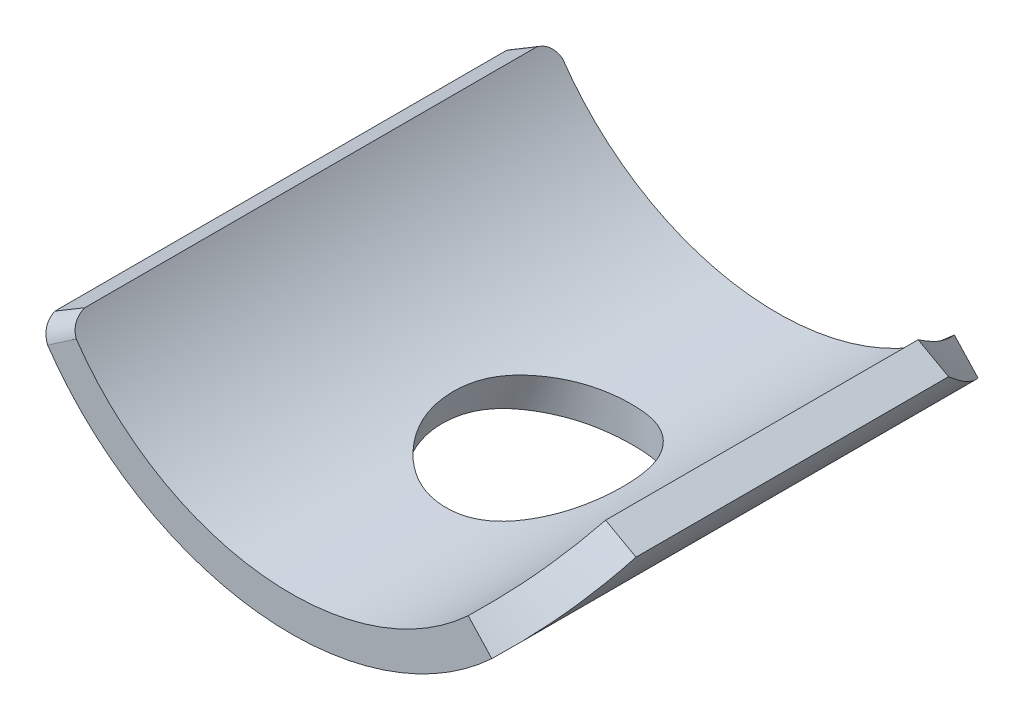
ISO-10303-21;
HEADER;
FILE_DESCRIPTION(('STEP AP214'),'2;1');
FILE_NAME('part.step','',(''),(''),'','','');
FILE_SCHEMA(('AUTOMOTIVE_DESIGN { 1 0 10303 214 1 1 1 1 }'));
ENDSEC;
DATA;
#1=APPLICATION_CONTEXT('core data for automotive mechanical design processes');
#2=APPLICATION_PROTOCOL_DEFINITION('international standard','automotive_design',2000,#1);
#3=PRODUCT_CONTEXT('',#1,'mechanical');
#4=PRODUCT('Part','Part','',(#3));
#5=PRODUCT_RELATED_PRODUCT_CATEGORY('part','',(#4));
#6=PRODUCT_DEFINITION_FORMATION('','',#4);
#7=PRODUCT_DEFINITION_CONTEXT('part definition',#1,'design');
#8=PRODUCT_DEFINITION('design','',#6,#7);
#9=PRODUCT_DEFINITION_SHAPE('','',#8);
#10=(LENGTH_UNIT() NAMED_UNIT(*) SI_UNIT(.MILLI.,.METRE.));
#11=(NAMED_UNIT(*) PLANE_ANGLE_UNIT() SI_UNIT($,.RADIAN.));
#12=(NAMED_UNIT(*) SI_UNIT($,.STERADIAN.) SOLID_ANGLE_UNIT());
#13=UNCERTAINTY_MEASURE_WITH_UNIT(LENGTH_MEASURE(1.E-05),#10,'distance_accuracy_value','');
#14=(GEOMETRIC_REPRESENTATION_CONTEXT(3) GLOBAL_UNCERTAINTY_ASSIGNED_CONTEXT((#13)) GLOBAL_UNIT_ASSIGNED_CONTEXT((#10,
#11,#12)) REPRESENTATION_CONTEXT('',''));
#15=CARTESIAN_POINT('',(0.,0.,0.));
#16=DIRECTION('',(0.,0.,1.));
#17=DIRECTION('',(1.,0.,0.));
#18=AXIS2_PLACEMENT_3D('',#15,#16,#17);
#19=CARTESIAN_POINT('',(-0.0587403609566177,3.73980298090454,-14.));
#20=DIRECTION('',(0.,0.,1.));
#21=DIRECTION('',(1.,0.,0.));
#22=AXIS2_PLACEMENT_3D('',#19,#20,#21);
#23=PLANE('',#22);
#24=CARTESIAN_POINT('',(5.72240006796672,-2.49144210664161,-14.));
#25=CARTESIAN_POINT('',(5.04226589985809,-1.75835444928324,-14.));
#26=B_SPLINE_CURVE_WITH_KNOTS('',1,(#24,#25),.UNSPECIFIED.,.F.,.F.,(2,2),(0.,1.),.UNSPECIFIED.);
#27=CARTESIAN_POINT('',(5.72240006796673,-2.49144210664161,-14.));
#28=VERTEX_POINT('',#27);
#29=CARTESIAN_POINT('',(5.0422658998581,-1.75835444928324,-14.));
#30=VERTEX_POINT('',#29);
#31=EDGE_CURVE('E12',#28,#30,#26,.T.);
#32=ORIENTED_EDGE('',*,*,#31,.F.);
#33=CARTESIAN_POINT('',(-0.0587403609566177,3.73980298090454,-14.));
#34=DIRECTION('',(0.,0.,-1.));
#35=DIRECTION('',(-1.,0.,0.));
#36=AXIS2_PLACEMENT_3D('',#33,#34,#35);
#37=CIRCLE('',#36,8.5);
#38=CARTESIAN_POINT('',(-7.06882307745616,-1.06735213494459,-14.));
#39=VERTEX_POINT('',#38);
#40=EDGE_CURVE('E143',#28,#39,#37,.T.);
#41=ORIENTED_EDGE('',*,*,#40,.T.);
#42=CARTESIAN_POINT('',(-6.24410746375033,-0.501804474256459,-14.));
#43=CARTESIAN_POINT('',(-7.06882307745615,-1.06735213494459,-14.));
#44=B_SPLINE_CURVE_WITH_KNOTS('',1,(#42,#43),.UNSPECIFIED.,.F.,.F.,(2,2),(0.,1.),.UNSPECIFIED.);
#45=CARTESIAN_POINT('',(-6.24410746375033,-0.501804474256458,-14.));
#46=VERTEX_POINT('',#45);
#47=EDGE_CURVE('E102',#39,#46,#44,.F.);
#48=ORIENTED_EDGE('',*,*,#47,.T.);
#49=CARTESIAN_POINT('',(-0.0587403609566177,3.73980298090454,-14.));
#50=DIRECTION('',(0.,0.,-1.));
#51=DIRECTION('',(-1.,0.,0.));
#52=AXIS2_PLACEMENT_3D('',#49,#50,#51);
#53=CIRCLE('',#52,7.5);
#54=EDGE_CURVE('E146',#30,#46,#53,.T.);
#55=ORIENTED_EDGE('',*,*,#54,.F.);
#56=EDGE_LOOP('',(#32,#41,#48,#55));
#57=FACE_BOUND('',#56,.T.);
#58=ADVANCED_FACE('F88',(#57),#23,.F.);
#59=CARTESIAN_POINT('',(-7.06882307745615,-1.06735213494459,-14.));
#60=CARTESIAN_POINT('',(-7.1560028578225,-0.940221335782435,-13.9592446659592));
#61=CARTESIAN_POINT('',(-7.22161561753153,-0.837451372219732,-13.8972039764516));
#62=CARTESIAN_POINT('',(-7.3165775530413,-0.685334152297158,-13.7305373097849));
#63=CARTESIAN_POINT('',(-7.34593460830596,-0.635975141826172,-13.6259131758616));
#64=CARTESIAN_POINT('',(-7.35883461853912,-0.61434720373666,-13.5));
#65=CARTESIAN_POINT('',(-6.24410746375033,-0.501804474256459,-14.));
#66=CARTESIAN_POINT('',(-6.32103071570813,-0.389630361699026,-13.9592447102836));
#67=CARTESIAN_POINT('',(-6.37892441087566,-0.298950860087465,-13.8972039764516));
#68=CARTESIAN_POINT('',(-6.46271435397251,-0.164729783685193,-13.7305373097849));
#69=CARTESIAN_POINT('',(-6.48861762664849,-0.121177734703874,-13.6259133017605));
#70=CARTESIAN_POINT('',(-6.5,-0.102094240837695,-13.5));
#71=B_SPLINE_SURFACE_WITH_KNOTS('',1,3,((#59,#60,#61,#62,#63,#64),(#65,#66,#67,#68,#69,#70)),
.UNSPECIFIED.,.F.,.F.,.F.,(2,2),(4,2,4),(0.,1.),(0.,0.5,1.),.UNSPECIFIED.);
#72=CARTESIAN_POINT('',(-7.06882307745615,-1.06735213494459,-14.));
#73=CARTESIAN_POINT('',(-7.1560028578225,-0.940221335782435,-13.9592446659592));
#74=CARTESIAN_POINT('',(-7.22161561753153,-0.837451372219732,-13.8972039764516));
#75=CARTESIAN_POINT('',(-7.3165775530413,-0.685334152297158,-13.7305373097849));
#76=CARTESIAN_POINT('',(-7.34593460830596,-0.635975141826172,-13.6259131758616));
#77=CARTESIAN_POINT('',(-7.35883461853912,-0.61434720373666,-13.5));
#78=B_SPLINE_CURVE_WITH_KNOTS('',3,(#72,#73,#74,#75,#76,#77),.UNSPECIFIED.,.F.,.F.,(4,2,4),(0.,
0.5,1.),.UNSPECIFIED.);
#79=CARTESIAN_POINT('',(-7.35883461853912,-0.61434720373666,-13.5));
#80=VERTEX_POINT('',#79);
#81=EDGE_CURVE('E164',#39,#80,#78,.T.);
#82=CARTESIAN_POINT('',(-7.35883461853912,-0.61434720373666,-13.5));
#83=CARTESIAN_POINT('',(-6.5,-0.102094240837695,-13.5));
#84=B_SPLINE_CURVE_WITH_KNOTS('',1,(#82,#83),.UNSPECIFIED.,.F.,.F.,(2,2),(0.,1.),.UNSPECIFIED.);
#85=CARTESIAN_POINT('',(-6.5,-0.102094240837695,-13.5));
#86=VERTEX_POINT('',#85);
#87=EDGE_CURVE('E263',#80,#86,#84,.T.);
#88=CARTESIAN_POINT('',(-6.5,-0.102094240837695,-13.5));
#89=CARTESIAN_POINT('',(-6.48861762664849,-0.121177734703874,-13.6259133017605));
#90=CARTESIAN_POINT('',(-6.46271435397251,-0.164729783685193,-13.7305373097849));
#91=CARTESIAN_POINT('',(-6.37892441087566,-0.298950860087465,-13.8972039764516));
#92=CARTESIAN_POINT('',(-6.32103071570813,-0.389630361699026,-13.9592447102836));
#93=CARTESIAN_POINT('',(-6.24410746375033,-0.501804474256459,-14.));
#94=B_SPLINE_CURVE_WITH_KNOTS('',3,(#88,#89,#90,#91,#92,#93),.UNSPECIFIED.,.F.,.F.,(4,2,4),(0.,
0.5,1.),.UNSPECIFIED.);
#95=EDGE_CURVE('E288',#46,#86,#94,.F.);
#96=ORIENTED_EDGE('',*,*,#47,.F.);
#97=ORIENTED_EDGE('',*,*,#81,.T.);
#98=ORIENTED_EDGE('',*,*,#87,.T.);
#99=ORIENTED_EDGE('',*,*,#95,.F.);
#100=EDGE_LOOP('',(#96,#97,#98,#99));
#101=FACE_BOUND('',#100,.T.);
#102=ADVANCED_FACE('F215',(#101),#71,.F.);
#103=CARTESIAN_POINT('',(-6.5,-0.102094240837694,-7.));
#104=DIRECTION('',(0.512252962898965,-0.858834618539118,0.));
#105=DIRECTION('',(0.,0.,1.));
#106=AXIS2_PLACEMENT_3D('',#103,#104,#105);
#107=PLANE('',#106);
#108=ORIENTED_EDGE('',*,*,#87,.F.);
#109=DIRECTION('',(0.,0.,-1.));
#110=VECTOR('',#109,1.);
#111=CARTESIAN_POINT('',(-7.35883461853912,-0.61434720373666,15.3763940383493));
#112=LINE('',#111,#110);
#113=CARTESIAN_POINT('',(-7.35883461853912,-0.61434720373666,-0.500000000000004));
#114=VERTEX_POINT('',#113);
#115=EDGE_CURVE('E380',#80,#114,#112,.F.);
#116=ORIENTED_EDGE('',*,*,#115,.T.);
#117=CARTESIAN_POINT('',(-6.5,-0.102094240837695,-0.500000000000004));
#118=CARTESIAN_POINT('',(-7.35883461853912,-0.61434720373666,-0.500000000000004));
#119=B_SPLINE_CURVE_WITH_KNOTS('',1,(#117,#118),.UNSPECIFIED.,.F.,.F.,(2,2),(0.,1.),.UNSPECIFIED.);
#120=CARTESIAN_POINT('',(-6.5,-0.102094240837694,-0.500000000000004));
#121=VERTEX_POINT('',#120);
#122=EDGE_CURVE('E498',#114,#121,#119,.F.);
#123=ORIENTED_EDGE('',*,*,#122,.T.);
#124=DIRECTION('',(0.,0.,1.));
#125=VECTOR('',#124,1.);
#126=CARTESIAN_POINT('',(-6.5,-0.102094240837694,-13.5));
#127=LINE('',#126,#125);
#128=EDGE_CURVE('E294',#86,#121,#127,.T.);
#129=ORIENTED_EDGE('',*,*,#128,.F.);
#130=EDGE_LOOP('',(#108,#116,#123,#129));
#131=FACE_BOUND('',#130,.T.);
#132=ADVANCED_FACE('F226',(#131),#107,.F.);
#133=CARTESIAN_POINT('',(-7.35883461853912,-0.61434720373666,-0.500000000000004));
#134=CARTESIAN_POINT('',(-7.31830615225423,-0.682296542057272,-0.219572146146254));
#135=CARTESIAN_POINT('',(-7.22693888159301,-0.836778159469825,-0.0529074162915048));
#136=CARTESIAN_POINT('',(-7.06882307745616,-1.06735213494458,0.));
#137=CARTESIAN_POINT('',(-6.5,-0.102094240837695,-0.500000000000004));
#138=CARTESIAN_POINT('',(-6.46423918038716,-0.16205022371192,-0.219568945219902));
#139=CARTESIAN_POINT('',(-6.38362161869937,-0.298356542424423,-0.052907495975535));
#140=CARTESIAN_POINT('',(-6.24410746375033,-0.501804474256452,0.));
#141=B_SPLINE_SURFACE_WITH_KNOTS('',1,3,((#133,#134,#135,#136),(#137,#138,#139,#140)),
.UNSPECIFIED.,.F.,.F.,.F.,(2,2),(4,4),(0.,1.),(0.,1.),.UNSPECIFIED.);
#142=CARTESIAN_POINT('',(-7.35883461853912,-0.61434720373666,-0.500000000000004));
#143=CARTESIAN_POINT('',(-7.31830615225423,-0.682296542057272,-0.219572146146254));
#144=CARTESIAN_POINT('',(-7.22693888159301,-0.836778159469825,-0.0529074162915048));
#145=CARTESIAN_POINT('',(-7.06882307745616,-1.06735213494458,0.));
#146=B_SPLINE_CURVE_WITH_KNOTS('',3,(#142,#143,#144,#145),.UNSPECIFIED.,.F.,.F.,(4,4),(0.,1.),.UNSPECIFIED.);
#147=CARTESIAN_POINT('',(-7.06882307745616,-1.06735213494458,0.));
#148=VERTEX_POINT('',#147);
#149=EDGE_CURVE('E379',#114,#148,#146,.T.);
#150=CARTESIAN_POINT('',(-7.06882307745616,-1.06735213494458,0.));
#151=CARTESIAN_POINT('',(-6.24410746375033,-0.501804474256452,0.));
#152=B_SPLINE_CURVE_WITH_KNOTS('',1,(#150,#151),.UNSPECIFIED.,.F.,.F.,(2,2),(0.,1.),.UNSPECIFIED.);
#153=CARTESIAN_POINT('',(-6.24410746375033,-0.501804474256452,0.));
#154=VERTEX_POINT('',#153);
#155=EDGE_CURVE('E377',#148,#154,#152,.T.);
#156=CARTESIAN_POINT('',(-6.24410746375033,-0.501804474256452,0.));
#157=CARTESIAN_POINT('',(-6.38362161869937,-0.298356542424423,-0.052907495975535));
#158=CARTESIAN_POINT('',(-6.46423918038716,-0.16205022371192,-0.219568945219902));
#159=CARTESIAN_POINT('',(-6.5,-0.102094240837695,-0.500000000000004));
#160=B_SPLINE_CURVE_WITH_KNOTS('',3,(#156,#157,#158,#159),.UNSPECIFIED.,.F.,.F.,(4,4),(0.,1.),.UNSPECIFIED.);
#161=EDGE_CURVE('E358',#121,#154,#160,.F.);
#162=ORIENTED_EDGE('',*,*,#122,.F.);
#163=ORIENTED_EDGE('',*,*,#149,.T.);
#164=ORIENTED_EDGE('',*,*,#155,.T.);
#165=ORIENTED_EDGE('',*,*,#161,.F.);
#166=EDGE_LOOP('',(#162,#163,#164,#165));
#167=FACE_BOUND('',#166,.T.);
#168=ADVANCED_FACE('F457',(#167),#141,.F.);
#169=CARTESIAN_POINT('',(-0.0587403609566177,3.73980298090454,0.));
#170=DIRECTION('',(0.,0.,-1.));
#171=DIRECTION('',(-1.,0.,0.));
#172=AXIS2_PLACEMENT_3D('',#169,#170,#171);
#173=PLANE('',#172);
#174=ORIENTED_EDGE('',*,*,#155,.F.);
#175=CARTESIAN_POINT('',(-0.0587403609566177,3.73980298090454,0.));
#176=DIRECTION('',(0.,0.,-1.));
#177=DIRECTION('',(-1.,0.,0.));
#178=AXIS2_PLACEMENT_3D('',#175,#176,#177);
#179=CIRCLE('',#178,8.5);
#180=CARTESIAN_POINT('',(5.72240006796672,-2.49144210664162,0.));
#181=VERTEX_POINT('',#180);
#182=EDGE_CURVE('E366',#148,#181,#179,.F.);
#183=ORIENTED_EDGE('',*,*,#182,.T.);
#184=CARTESIAN_POINT('',(5.04226589985809,-1.75835444928325,0.));
#185=CARTESIAN_POINT('',(5.72240006796672,-2.49144210664162,0.));
#186=B_SPLINE_CURVE_WITH_KNOTS('',1,(#184,#185),.UNSPECIFIED.,.F.,.F.,(2,2),(0.,1.),.UNSPECIFIED.);
#187=CARTESIAN_POINT('',(5.04226589985809,-1.75835444928325,0.));
#188=VERTEX_POINT('',#187);
#189=EDGE_CURVE('E374',#181,#188,#186,.F.);
#190=ORIENTED_EDGE('',*,*,#189,.T.);
#191=CARTESIAN_POINT('',(-0.0587403609566177,3.73980298090454,0.));
#192=DIRECTION('',(0.,0.,1.));
#193=DIRECTION('',(1.,0.,0.));
#194=AXIS2_PLACEMENT_3D('',#191,#192,#193);
#195=CIRCLE('',#194,7.5);
#196=EDGE_CURVE('E346',#154,#188,#195,.T.);
#197=ORIENTED_EDGE('',*,*,#196,.F.);
#198=EDGE_LOOP('',(#174,#183,#190,#197));
#199=FACE_BOUND('',#198,.T.);
#200=ADVANCED_FACE('F372',(#199),#173,.F.);
#201=CARTESIAN_POINT('',(5.72240006796672,-2.49144210664162,0.));
#202=CARTESIAN_POINT('',(6.37980441013859,-1.88152438277044,-0.833460123970667));
#203=CARTESIAN_POINT('',(6.93954472309035,-1.16714983947231,-1.66653987602934));
#204=CARTESIAN_POINT('',(7.37449871479423,-0.382933591171183,-2.50000000000001));
#205=CARTESIAN_POINT('',(5.04226589985809,-1.75835444928325,0.));
#206=CARTESIAN_POINT('',(5.62231895819569,-1.22020065507955,-0.833446335258995));
#207=CARTESIAN_POINT('',(6.11622341542428,-0.589849824700828,-1.66655366474101));
#208=CARTESIAN_POINT('',(6.50000000000001,0.102094240837726,-2.50000000000001));
#209=B_SPLINE_SURFACE_WITH_KNOTS('',1,3,((#201,#202,#203,#204),(#205,#206,#207,#208)),
.UNSPECIFIED.,.F.,.F.,.F.,(2,2),(4,4),(0.,1.),(0.,1.),.UNSPECIFIED.);
#210=CARTESIAN_POINT('',(5.72240006796672,-2.49144210664162,0.));
#211=CARTESIAN_POINT('',(6.37980441013859,-1.88152438277044,-0.833460123970667));
#212=CARTESIAN_POINT('',(6.93954472309035,-1.16714983947231,-1.66653987602934));
#213=CARTESIAN_POINT('',(7.37449871479423,-0.382933591171183,-2.50000000000001));
#214=B_SPLINE_CURVE_WITH_KNOTS('',3,(#210,#211,#212,#213),.UNSPECIFIED.,.F.,.F.,(4,4),(0.,1.),.UNSPECIFIED.);
#215=CARTESIAN_POINT('',(7.37449871479423,-0.382933591171183,-2.50000000000001));
#216=VERTEX_POINT('',#215);
#217=EDGE_CURVE('E363',#181,#216,#214,.T.);
#218=CARTESIAN_POINT('',(7.37449871479423,-0.382933591171183,-2.50000000000001));
#219=CARTESIAN_POINT('',(6.50000000000001,0.102094240837726,-2.50000000000001));
#220=B_SPLINE_CURVE_WITH_KNOTS('',1,(#218,#219),.UNSPECIFIED.,.F.,.F.,(2,2),(0.,1.),.UNSPECIFIED.);
#221=CARTESIAN_POINT('',(6.50000000000001,0.102094240837726,-2.50000000000001));
#222=VERTEX_POINT('',#221);
#223=EDGE_CURVE('E424',#216,#222,#220,.T.);
#224=CARTESIAN_POINT('',(6.50000000000001,0.102094240837726,-2.50000000000001));
#225=CARTESIAN_POINT('',(6.11622341542428,-0.589849824700828,-1.66655366474101));
#226=CARTESIAN_POINT('',(5.62231895819569,-1.22020065507955,-0.833446335258995));
#227=CARTESIAN_POINT('',(5.04226589985809,-1.75835444928325,0.));
#228=B_SPLINE_CURVE_WITH_KNOTS('',3,(#224,#225,#226,#227),.UNSPECIFIED.,.F.,.F.,(4,4),(0.,1.),.UNSPECIFIED.);
#229=EDGE_CURVE('E342',#188,#222,#228,.F.);
#230=ORIENTED_EDGE('',*,*,#189,.F.);
#231=ORIENTED_EDGE('',*,*,#217,.T.);
#232=ORIENTED_EDGE('',*,*,#223,.T.);
#233=ORIENTED_EDGE('',*,*,#229,.F.);
#234=EDGE_LOOP('',(#230,#231,#232,#233));
#235=FACE_BOUND('',#234,.T.);
#236=ADVANCED_FACE('F388',(#235),#209,.F.);
#237=CARTESIAN_POINT('',(6.50000000000001,0.102094240837724,-7.));
#238=DIRECTION('',(-0.485027832008909,-0.874498714794217,0.));
#239=DIRECTION('',(0.,0.,-1.));
#240=AXIS2_PLACEMENT_3D('',#237,#238,#239);
#241=PLANE('',#240);
#242=ORIENTED_EDGE('',*,*,#223,.F.);
#243=DIRECTION('',(0.,0.,-1.));
#244=VECTOR('',#243,1.);
#245=CARTESIAN_POINT('',(7.37449871479423,-0.382933591171183,15.3763940383493));
#246=LINE('',#245,#244);
#247=CARTESIAN_POINT('',(7.37449871479423,-0.382933591171183,-11.5));
#248=VERTEX_POINT('',#247);
#249=EDGE_CURVE('E170',#216,#248,#246,.T.);
#250=ORIENTED_EDGE('',*,*,#249,.T.);
#251=CARTESIAN_POINT('',(6.50000000000001,0.102094240837726,-11.5));
#252=CARTESIAN_POINT('',(7.37449871479423,-0.382933591171183,-11.5));
#253=B_SPLINE_CURVE_WITH_KNOTS('',1,(#251,#252),.UNSPECIFIED.,.F.,.F.,(2,2),(0.,1.),.UNSPECIFIED.);
#254=CARTESIAN_POINT('',(6.50000000000001,0.102094240837724,-11.5));
#255=VERTEX_POINT('',#254);
#256=EDGE_CURVE('E110',#248,#255,#253,.F.);
#257=ORIENTED_EDGE('',*,*,#256,.T.);
#258=DIRECTION('',(0.,0.,-1.));
#259=VECTOR('',#258,1.);
#260=CARTESIAN_POINT('',(6.50000000000001,0.102094240837724,-2.50000000000001));
#261=LINE('',#260,#259);
#262=EDGE_CURVE('E339',#222,#255,#261,.T.);
#263=ORIENTED_EDGE('',*,*,#262,.F.);
#264=EDGE_LOOP('',(#242,#250,#257,#263));
#265=FACE_BOUND('',#264,.T.);
#266=ADVANCED_FACE('F192',(#265),#241,.F.);
#267=CARTESIAN_POINT('',(7.37449871479423,-0.382933591171183,-11.5));
#268=CARTESIAN_POINT('',(6.93954472309035,-1.16714983947231,-12.3334601239707));
#269=CARTESIAN_POINT('',(6.3798044101386,-1.88152438277044,-13.1665398760293));
#270=CARTESIAN_POINT('',(5.72240006796672,-2.49144210664161,-14.));
#271=CARTESIAN_POINT('',(6.50000000000001,0.102094240837726,-11.5));
#272=CARTESIAN_POINT('',(6.11622341542428,-0.589849824700827,-12.333446335259));
#273=CARTESIAN_POINT('',(5.62231895819569,-1.22020065507954,-13.166553664741));
#274=CARTESIAN_POINT('',(5.04226589985809,-1.75835444928324,-14.));
#275=B_SPLINE_SURFACE_WITH_KNOTS('',1,3,((#267,#268,#269,#270),(#271,#272,#273,#274)),
.UNSPECIFIED.,.F.,.F.,.F.,(2,2),(4,4),(0.,1.),(0.,1.),.UNSPECIFIED.);
#276=CARTESIAN_POINT('',(7.37449871479423,-0.382933591171183,-11.5));
#277=CARTESIAN_POINT('',(6.93954472309035,-1.16714983947231,-12.3334601239707));
#278=CARTESIAN_POINT('',(6.3798044101386,-1.88152438277044,-13.1665398760293));
#279=CARTESIAN_POINT('',(5.72240006796672,-2.49144210664161,-14.));
#280=B_SPLINE_CURVE_WITH_KNOTS('',3,(#276,#277,#278,#279),.UNSPECIFIED.,.F.,.F.,(4,4),(0.,1.),.UNSPECIFIED.);
#281=EDGE_CURVE('E160',#248,#28,#280,.T.);
#282=CARTESIAN_POINT('',(5.04226589985809,-1.75835444928324,-14.));
#283=CARTESIAN_POINT('',(5.62231895819569,-1.22020065507954,-13.166553664741));
#284=CARTESIAN_POINT('',(6.11622341542428,-0.589849824700827,-12.333446335259));
#285=CARTESIAN_POINT('',(6.50000000000001,0.102094240837726,-11.5));
#286=B_SPLINE_CURVE_WITH_KNOTS('',3,(#282,#283,#284,#285),.UNSPECIFIED.,.F.,.F.,(4,4),(0.,1.),.UNSPECIFIED.);
#287=EDGE_CURVE('E290',#255,#30,#286,.F.);
#288=ORIENTED_EDGE('',*,*,#281,.T.);
#289=ORIENTED_EDGE('',*,*,#31,.T.);
#290=ORIENTED_EDGE('',*,*,#287,.F.);
#291=ORIENTED_EDGE('',*,*,#256,.F.);
#292=EDGE_LOOP('',(#288,#289,#290,#291));
#293=FACE_BOUND('',#292,.T.);
#294=ADVANCED_FACE('F168',(#293),#275,.F.);
#295=CARTESIAN_POINT('',(-2.70488945296242,-4.33781393145748,-7.));
#296=CARTESIAN_POINT('',(-2.7053168674194,-4.33767391461965,-7.35563069338047));
#297=CARTESIAN_POINT('',(-2.64238783459714,-4.35911998484785,-7.68600810944753));
#298=CARTESIAN_POINT('',(-2.4508660207142,-4.4169231819772,-8.14369431757805));
#299=CARTESIAN_POINT('',(-2.37079198410656,-4.44032203357853,-8.28994306762654));
#300=CARTESIAN_POINT('',(-2.22577393921076,-4.47947146766387,-8.49984621370676));
#301=CARTESIAN_POINT('',(-2.17328201834677,-4.49318724507639,-8.56823559923473));
#302=CARTESIAN_POINT('',(-2.08823914007403,-4.5144073584341,-8.66845218277857));
#303=CARTESIAN_POINT('',(-2.05884066942622,-4.52158787832526,-8.70146312816851));
#304=CARTESIAN_POINT('',(-2.01315730751294,-4.53246994993133,-8.75038767256636));
#305=CARTESIAN_POINT('',(-1.99766524637868,-4.53611581828127,-8.76659720841781));
#306=CARTESIAN_POINT('',(-1.96615104814999,-4.54343588758203,-8.79881898889169));
#307=CARTESIAN_POINT('',(-1.95078978527314,-4.5469606172787,-8.81418554700881));
#308=CARTESIAN_POINT('',(-1.66266023874681,-4.61212744390549,-9.09569340073405));
#309=CARTESIAN_POINT('',(-1.35942229535305,-4.66686113429306,-9.29435483660158));
#310=CARTESIAN_POINT('',(-0.856738969743334,-4.72433560376127,-9.49291629188618));
#311=CARTESIAN_POINT('',(-0.681232914962341,-4.73935764116155,-9.5425316605616));
#312=CARTESIAN_POINT('',(-0.314779995755478,-4.75832066728986,-9.60861883174021));
#313=CARTESIAN_POINT('',(-0.124562787080318,-4.76227190879472,-9.6250910034332));
#314=CARTESIAN_POINT('',(0.472431924758798,-4.7529172011237,-9.624789954115));
#315=CARTESIAN_POINT('',(0.839383056626966,-4.71934400840757,-9.55853542592125));
#316=CARTESIAN_POINT('',(1.34004005387795,-4.64601014103392,-9.36007289065821));
#317=CARTESIAN_POINT('',(1.49867836842502,-4.61770894333032,-9.27740525507513));
#318=CARTESIAN_POINT('',(1.72421609579892,-4.57145179433264,-9.1286336159574));
#319=CARTESIAN_POINT('',(1.7973274079396,-4.55539647934861,-9.0749147052943));
#320=CARTESIAN_POINT('',(1.90390244078465,-4.53058779854495,-8.98814379286388));
#321=CARTESIAN_POINT('',(1.93891222882115,-4.52219715466254,-8.95818806431445));
#322=CARTESIAN_POINT('',(1.99065615365561,-4.50945695276735,-8.91170633488135));
#323=CARTESIAN_POINT('',(2.00777567449366,-4.50518450444306,-8.89595440230216));
#324=CARTESIAN_POINT('',(2.04175821669501,-4.49659264361443,-8.86393449160746));
#325=CARTESIAN_POINT('',(2.05919178778288,-4.49212524287446,-8.84710308913487));
#326=CARTESIAN_POINT('',(2.3339873708545,-4.42084921352868,-8.57573928818312));
#327=CARTESIAN_POINT('',(2.5247629050784,-4.35916726626157,-8.2954609857257));
#328=CARTESIAN_POINT('',(2.71448790267416,-4.29534835838729,-7.83772791499121));
#329=CARTESIAN_POINT('',(2.76164699242576,-4.27870830709433,-7.67893095523831));
#330=CARTESIAN_POINT('',(2.82436449676688,-4.25637200956782,-7.3488984967164));
#331=CARTESIAN_POINT('',(2.83992566176602,-4.25067480897907,-7.17837740024992));
#332=CARTESIAN_POINT('',(2.83950821671792,-4.25082623522404,-6.64386988851107));
#333=CARTESIAN_POINT('',(2.77691869896377,-4.27436146084921,-6.3131125939856));
#334=CARTESIAN_POINT('',(2.58726323388747,-4.33813694688441,-5.85534822214805));
#335=CARTESIAN_POINT('',(2.50803368344683,-4.36400262687485,-5.70915535986064));
#336=CARTESIAN_POINT('',(2.36455319870348,-4.40759825535693,-5.49945895891719));
#337=CARTESIAN_POINT('',(2.31261867154961,-4.42292056866418,-5.43115897401732));
#338=CARTESIAN_POINT('',(2.22846885359669,-4.44674231371123,-5.33110721978943));
#339=CARTESIAN_POINT('',(2.19937754667705,-4.45482202244022,-5.29815633890045));
#340=CARTESIAN_POINT('',(2.15416768690945,-4.467101540853,-5.24932957334746));
#341=CARTESIAN_POINT('',(2.13883558473815,-4.47122133574911,-5.23315391079321));
#342=CARTESIAN_POINT('',(2.10764529679695,-4.47950559997095,-5.20100243761154));
#343=CARTESIAN_POINT('',(2.09248505660465,-4.48348900932678,-5.18571391350247));
#344=CARTESIAN_POINT('',(1.80654413362232,-4.55766735154929,-4.90414000340222));
#345=CARTESIAN_POINT('',(1.50516914440679,-4.62189356329939,-4.70545555166942));
#346=CARTESIAN_POINT('',(1.00452202644596,-4.6951195798019,-4.50691830484784));
#347=CARTESIAN_POINT('',(0.829567330952878,-4.71564344362984,-4.45732079437025));
#348=CARTESIAN_POINT('',(0.463874002959177,-4.74609938833738,-4.39128891700762));
#349=CARTESIAN_POINT('',(0.273861390709693,-4.75601887574593,-4.37485400925181));
#350=CARTESIAN_POINT('',(-0.323154886949755,-4.76540346803304,-4.37529724659774));
#351=CARTESIAN_POINT('',(-0.69098226225955,-4.74336025094256,-4.441611017907));
#352=CARTESIAN_POINT('',(-1.19368237766619,-4.6857743689682,-4.64010909448885));
#353=CARTESIAN_POINT('',(-1.35312405062471,-4.66246615414168,-4.72277968995247));
#354=CARTESIAN_POINT('',(-1.57998833746357,-4.6233120806279,-4.87154243805238));
#355=CARTESIAN_POINT('',(-1.65356215323061,-4.60956012075497,-4.92525616323644));
#356=CARTESIAN_POINT('',(-1.76085425595139,-4.58811023169452,-5.01201596473864));
#357=CARTESIAN_POINT('',(-1.7961069571314,-4.58082314800356,-5.04196743419372));
#358=CARTESIAN_POINT('',(-1.8482202285142,-4.5697142896864,-5.08844194180789));
#359=CARTESIAN_POINT('',(-1.86546369460006,-4.56598162327193,-5.1041913282512));
#360=CARTESIAN_POINT('',(-1.89969564688922,-4.55846133945206,-5.13620586894833));
#361=CARTESIAN_POINT('',(-1.91730591284682,-4.55453311622684,-5.15308033446911));
#362=CARTESIAN_POINT('',(-2.19337523303415,-4.49210432496339,-5.42361369163495));
#363=CARTESIAN_POINT('',(-2.38560608888269,-4.43659578860006,-5.70350733499171));
#364=CARTESIAN_POINT('',(-2.64107817850853,-4.35953849540046,-6.3138426478713));
#365=CARTESIAN_POINT('',(-2.70446203850544,-4.3379539482953,-6.64436930661953));
#366=CARTESIAN_POINT('',(-2.70488945296242,-4.33781393145748,-7.));
#367=CARTESIAN_POINT('',(-2.39357779507938,-3.38750605941489,-7.));
#368=CARTESIAN_POINT('',(-2.3939549254826,-3.38738251514621,-7.35563069338047));
#369=CARTESIAN_POINT('',(-2.33842930828649,-3.40630551828875,-7.68600810944753));
#370=CARTESIAN_POINT('',(-2.16943947250743,-3.45730833928523,-8.14369431757805));
#371=CARTESIAN_POINT('',(-2.09878591079481,-3.47795438481582,-8.28994306762654));
#372=CARTESIAN_POINT('',(-1.97082881235734,-3.51249800312641,-8.49984621370676));
#373=CARTESIAN_POINT('',(-1.92451241159499,-3.52460015966687,-8.56823559923473));
#374=CARTESIAN_POINT('',(-1.84947457782493,-3.54332378910014,-8.66845218277857));
#375=CARTESIAN_POINT('',(-1.82353475078273,-3.54965954194528,-8.70146312816851));
#376=CARTESIAN_POINT('',(-1.78322590203572,-3.559261369833,-8.75038767256636));
#377=CARTESIAN_POINT('',(-1.76955643632902,-3.56247831249471,-8.76659720841781));
#378=CARTESIAN_POINT('',(-1.74174979083312,-3.56893719717184,-8.79881898889169));
#379=CARTESIAN_POINT('',(-1.72819573535355,-3.57204725278656,-8.81418554700881));
#380=CARTESIAN_POINT('',(-1.4739637825362,-3.62954739392784,-9.09569340073405));
#381=CARTESIAN_POINT('',(-1.20640089130641,-3.67784182662276,-9.29435483660158));
#382=CARTESIAN_POINT('',(-0.762856780474308,-3.72855459380059,-9.49291629188618));
#383=CARTESIAN_POINT('',(-0.60799849684402,-3.74180933268319,-9.5425316605616));
#384=CARTESIAN_POINT('',(-0.284657685779142,-3.7585414145611,-9.60861883174021));
#385=CARTESIAN_POINT('',(-0.116818972242236,-3.76202780412422,-9.6250910034332));
#386=CARTESIAN_POINT('',(0.409941067615808,-3.75377365029685,-9.624789954115));
#387=CARTESIAN_POINT('',(0.733721478087721,-3.72415024495909,-9.55853542592125));
#388=CARTESIAN_POINT('',(1.17547765213271,-3.6594438913941,-9.36007289065821));
#389=CARTESIAN_POINT('',(1.31545263555659,-3.63447224636151,-9.27740525507513));
#390=CARTESIAN_POINT('',(1.51445651265121,-3.59365711489297,-9.1286336159574));
#391=CARTESIAN_POINT('',(1.57896649395181,-3.5794906604953,-9.0749147052943));
#392=CARTESIAN_POINT('',(1.67300328763862,-3.55760064802148,-8.98814379286388));
#393=CARTESIAN_POINT('',(1.70389427708259,-3.55019713871347,-8.95818806431445));
#394=CARTESIAN_POINT('',(1.74955068134829,-3.53895578410007,-8.91170633488135));
#395=CARTESIAN_POINT('',(1.76465614091128,-3.53518597675511,-8.89595440230216));
#396=CARTESIAN_POINT('',(1.79464073697129,-3.52760492308279,-8.86393449160746));
#397=CARTESIAN_POINT('',(1.81002329969588,-3.52366309890046,-8.84710308913487));
#398=CARTESIAN_POINT('',(2.05248999064142,-3.46077248477183,-8.57573928818312));
#399=CARTESIAN_POINT('',(2.2208213443684,-3.40634723718321,-8.2954609857257));
#400=CARTESIAN_POINT('',(2.38822575401171,-3.35003643611766,-7.83772791499121));
#401=CARTESIAN_POINT('',(2.42983671555725,-3.33535403791799,-7.67893095523831));
#402=CARTESIAN_POINT('',(2.48517568997588,-3.31564554010048,-7.3488984967164));
#403=CARTESIAN_POINT('',(2.49890612968101,-3.31061859840453,-7.17837740024992));
#404=CARTESIAN_POINT('',(2.49853779581503,-3.31075220979715,-6.64386988851107));
#405=CARTESIAN_POINT('',(2.44331175073784,-3.33151858534877,-6.3131125939856));
#406=CARTESIAN_POINT('',(2.27596869331757,-3.38779107302688,-5.85534822214805));
#407=CARTESIAN_POINT('',(2.20606026645819,-3.41061373184198,-5.70915535986064));
#408=CARTESIAN_POINT('',(2.07945983874347,-3.44908046285558,-5.49945895891719));
#409=CARTESIAN_POINT('',(2.03363525596064,-3.46260015106786,-5.43115897401732));
#410=CARTESIAN_POINT('',(1.95938541659042,-3.48361933787408,-5.33110721978943));
#411=CARTESIAN_POINT('',(1.9337166163672,-3.49074849263495,-5.29815633890045));
#412=CARTESIAN_POINT('',(1.89382556363109,-3.5015833618227,-5.24932957334746));
#413=CARTESIAN_POINT('',(1.88029723818583,-3.50521847496633,-5.23315391079321));
#414=CARTESIAN_POINT('',(1.85277639588477,-3.51252811986795,-5.20100243761154));
#415=CARTESIAN_POINT('',(1.83939971336215,-3.51604289282898,-5.18571391350247));
#416=CARTESIAN_POINT('',(1.58709889896598,-3.5814943712606,-4.90414000340222));
#417=CARTESIAN_POINT('',(1.32117979083462,-3.63816455809893,-4.70545555166942));
#418=CARTESIAN_POINT('',(0.879432333810359,-3.70277574913055,-4.50691830484784));
#419=CARTESIAN_POINT('',(0.725060543669408,-3.72088504074344,-4.45732079437025));
#420=CARTESIAN_POINT('',(0.402389960145554,-3.74775793313245,-4.39128891700762));
#421=CARTESIAN_POINT('',(0.234731772866598,-3.75651042202235,-4.37485400925181));
#422=CARTESIAN_POINT('',(-0.292047295656445,-3.76479094462862,-4.37529724659774));
#423=CARTESIAN_POINT('',(-0.616600862106264,-3.74534104719584,-4.441611017907));
#424=CARTESIAN_POINT('',(-1.06015978746506,-3.69452997486553,-4.64010909448885));
#425=CARTESIAN_POINT('',(-1.20084361654611,-3.67396390295977,-4.72277968995247));
#426=CARTESIAN_POINT('',(-1.40101798728628,-3.63941619103585,-4.87154243805238));
#427=CARTESIAN_POINT('',(-1.46593606002191,-3.62728210879503,-4.92525616323644));
#428=CARTESIAN_POINT('',(-1.56060556242259,-3.60835573609463,-5.01201596473864));
#429=CARTESIAN_POINT('',(-1.59171088699319,-3.60192595636731,-5.04196743419372));
#430=CARTESIAN_POINT('',(-1.63769318527213,-3.59212402255806,-5.08844194180789));
#431=CARTESIAN_POINT('',(-1.65290800828906,-3.58883049336882,-5.1041913282512));
#432=CARTESIAN_POINT('',(-1.68311267207362,-3.58219494882187,-5.13620586894833));
#433=CARTESIAN_POINT('',(-1.6986511420362,-3.5787288695055,-5.15308033446911));
#434=CARTESIAN_POINT('',(-1.94224171867209,-3.52364464192011,-5.42361369163495));
#435=CARTESIAN_POINT('',(-2.11185717971492,-3.47466652159952,-5.70350733499171));
#436=CARTESIAN_POINT('',(-2.33727372938478,-3.40667479230575,-6.3138426478713));
#437=CARTESIAN_POINT('',(-2.39320066467616,-3.38762960368356,-6.64436930661953));
#438=CARTESIAN_POINT('',(-2.39357779507938,-3.38750605941489,-7.));
#439=B_SPLINE_SURFACE_WITH_KNOTS('',1,3,((#295,#296,#297,#298,#299,#300,#301,#302,#303,#304,
#305,#306,#307,#308,#309,#310,#311,#312,#313,#314,#315,#316,#317,#318,#319,#320,#321,#322,#323,
#324,#325,#326,#327,#328,#329,#330,#331,#332,#333,#334,#335,#336,#337,#338,#339,#340,#341,#342,
#343,#344,#345,#346,#347,#348,#349,#350,#351,#352,#353,#354,#355,#356,#357,#358,#359,#360,#361,
#362,#363,#364,#365,#366),(#367,#368,#369,#370,#371,#372,#373,#374,#375,#376,#377,#378,#379,
#380,#381,#382,#383,#384,#385,#386,#387,#388,#389,#390,#391,#392,#393,#394,#395,#396,#397,#398,
#399,#400,#401,#402,#403,#404,#405,#406,#407,#408,#409,#410,#411,#412,#413,#414,#415,#416,#417,
#418,#419,#420,#421,#422,#423,#424,#425,#426,#427,#428,#429,#430,#431,#432,#433,#434,#435,#436,
#437,#438)),.UNSPECIFIED.,.F.,.T.,.F.,(2,2),(4,2,2,2,2,2,2,2,2,2,2,2,2,2,2,2,2,2,2,2,2,2,2,2,2,
2,2,2,2,2,2,2,2,2,2,4),(0.,1.),(0.,0.0625,0.09375,0.109375,0.1171875,0.12109375,0.125,0.1875,
0.21875,0.25,0.3125,0.34375,0.359375,0.3671875,0.37109375,0.375,0.4375,0.46875,0.5,0.5625,
0.59375,0.609375,0.6171875,0.62109375,0.625,0.6875,0.71875,0.75,0.8125,0.84375,0.859375,
0.8671875,0.87109375,0.875,0.9375,1.),.UNSPECIFIED.);
#440=CARTESIAN_POINT('',(-2.39357779507938,-3.38750605941489,-7.));
#441=CARTESIAN_POINT('',(-2.39320066467616,-3.38762960368356,-6.64436930661953));
#442=CARTESIAN_POINT('',(-2.33727372938478,-3.40667479230575,-6.3138426478713));
#443=CARTESIAN_POINT('',(-2.11185717971492,-3.47466652159952,-5.70350733499171));
#444=CARTESIAN_POINT('',(-1.94224171867209,-3.52364464192011,-5.42361369163495));
#445=CARTESIAN_POINT('',(-1.6986511420362,-3.5787288695055,-5.15308033446911));
#446=CARTESIAN_POINT('',(-1.68311267207362,-3.58219494882187,-5.13620586894833));
#447=CARTESIAN_POINT('',(-1.65290800828906,-3.58883049336882,-5.1041913282512));
#448=CARTESIAN_POINT('',(-1.63769318527213,-3.59212402255806,-5.08844194180789));
#449=CARTESIAN_POINT('',(-1.59171088699319,-3.60192595636731,-5.04196743419372));
#450=CARTESIAN_POINT('',(-1.56060556242259,-3.60835573609463,-5.01201596473864));
#451=CARTESIAN_POINT('',(-1.46593606002191,-3.62728210879503,-4.92525616323644));
#452=CARTESIAN_POINT('',(-1.40101798728628,-3.63941619103585,-4.87154243805238));
#453=CARTESIAN_POINT('',(-1.20084361654611,-3.67396390295977,-4.72277968995247));
#454=CARTESIAN_POINT('',(-1.06015978746506,-3.69452997486553,-4.64010909448885));
#455=CARTESIAN_POINT('',(-0.616600862106264,-3.74534104719584,-4.441611017907));
#456=CARTESIAN_POINT('',(-0.292047295656445,-3.76479094462862,-4.37529724659774));
#457=CARTESIAN_POINT('',(0.234731772866598,-3.75651042202235,-4.37485400925181));
#458=CARTESIAN_POINT('',(0.402389960145554,-3.74775793313245,-4.39128891700762));
#459=CARTESIAN_POINT('',(0.725060543669408,-3.72088504074344,-4.45732079437025));
#460=CARTESIAN_POINT('',(0.879432333810359,-3.70277574913055,-4.50691830484784));
#461=CARTESIAN_POINT('',(1.32117979083462,-3.63816455809893,-4.70545555166942));
#462=CARTESIAN_POINT('',(1.58709889896598,-3.5814943712606,-4.90414000340222));
#463=CARTESIAN_POINT('',(1.83939971336215,-3.51604289282898,-5.18571391350247));
#464=CARTESIAN_POINT('',(1.85277639588477,-3.51252811986795,-5.20100243761154));
#465=CARTESIAN_POINT('',(1.88029723818583,-3.50521847496633,-5.23315391079321));
#466=CARTESIAN_POINT('',(1.89382556363109,-3.5015833618227,-5.24932957334746));
#467=CARTESIAN_POINT('',(1.9337166163672,-3.49074849263495,-5.29815633890045));
#468=CARTESIAN_POINT('',(1.95938541659042,-3.48361933787408,-5.33110721978943));
#469=CARTESIAN_POINT('',(2.03363525596064,-3.46260015106786,-5.43115897401732));
#470=CARTESIAN_POINT('',(2.07945983874347,-3.44908046285558,-5.49945895891719));
#471=CARTESIAN_POINT('',(2.20606026645819,-3.41061373184198,-5.70915535986064));
#472=CARTESIAN_POINT('',(2.27596869331757,-3.38779107302688,-5.85534822214805));
#473=CARTESIAN_POINT('',(2.44331175073784,-3.33151858534877,-6.3131125939856));
#474=CARTESIAN_POINT('',(2.49853779581503,-3.31075220979715,-6.64386988851107));
#475=CARTESIAN_POINT('',(2.49890612968101,-3.31061859840453,-7.17837740024992));
#476=CARTESIAN_POINT('',(2.48517568997588,-3.31564554010048,-7.3488984967164));
#477=CARTESIAN_POINT('',(2.42983671555725,-3.33535403791799,-7.67893095523831));
#478=CARTESIAN_POINT('',(2.38822575401171,-3.35003643611766,-7.83772791499121));
#479=CARTESIAN_POINT('',(2.2208213443684,-3.40634723718321,-8.2954609857257));
#480=CARTESIAN_POINT('',(2.05248999064142,-3.46077248477183,-8.57573928818312));
#481=CARTESIAN_POINT('',(1.81002329969588,-3.52366309890046,-8.84710308913487));
#482=CARTESIAN_POINT('',(1.79464073697129,-3.52760492308279,-8.86393449160746));
#483=CARTESIAN_POINT('',(1.76465614091128,-3.53518597675511,-8.89595440230216));
#484=CARTESIAN_POINT('',(1.74955068134829,-3.53895578410007,-8.91170633488135));
#485=CARTESIAN_POINT('',(1.70389427708259,-3.55019713871347,-8.95818806431445));
#486=CARTESIAN_POINT('',(1.67300328763862,-3.55760064802148,-8.98814379286388));
#487=CARTESIAN_POINT('',(1.57896649395181,-3.5794906604953,-9.0749147052943));
#488=CARTESIAN_POINT('',(1.51445651265121,-3.59365711489297,-9.1286336159574));
#489=CARTESIAN_POINT('',(1.31545263555659,-3.63447224636151,-9.27740525507513));
#490=CARTESIAN_POINT('',(1.17547765213271,-3.6594438913941,-9.36007289065821));
#491=CARTESIAN_POINT('',(0.733721478087721,-3.72415024495909,-9.55853542592125));
#492=CARTESIAN_POINT('',(0.409941067615808,-3.75377365029685,-9.624789954115));
#493=CARTESIAN_POINT('',(-0.116818972242236,-3.76202780412422,-9.6250910034332));
#494=CARTESIAN_POINT('',(-0.284657685779142,-3.7585414145611,-9.60861883174021));
#495=CARTESIAN_POINT('',(-0.60799849684402,-3.74180933268319,-9.5425316605616));
#496=CARTESIAN_POINT('',(-0.762856780474308,-3.72855459380059,-9.49291629188618));
#497=CARTESIAN_POINT('',(-1.20640089130641,-3.67784182662276,-9.29435483660158));
#498=CARTESIAN_POINT('',(-1.4739637825362,-3.62954739392784,-9.09569340073405));
#499=CARTESIAN_POINT('',(-1.72819573535355,-3.57204725278656,-8.81418554700881));
#500=CARTESIAN_POINT('',(-1.74174979083312,-3.56893719717184,-8.79881898889169));
#501=CARTESIAN_POINT('',(-1.76955643632902,-3.56247831249471,-8.76659720841781));
#502=CARTESIAN_POINT('',(-1.78322590203572,-3.559261369833,-8.75038767256636));
#503=CARTESIAN_POINT('',(-1.82353475078273,-3.54965954194528,-8.70146312816851));
#504=CARTESIAN_POINT('',(-1.84947457782493,-3.54332378910014,-8.66845218277857));
#505=CARTESIAN_POINT('',(-1.92451241159499,-3.52460015966687,-8.56823559923473));
#506=CARTESIAN_POINT('',(-1.97082881235734,-3.51249800312641,-8.49984621370676));
#507=CARTESIAN_POINT('',(-2.09878591079481,-3.47795438481582,-8.28994306762654));
#508=CARTESIAN_POINT('',(-2.16943947250743,-3.45730833928523,-8.14369431757805));
#509=CARTESIAN_POINT('',(-2.33842930828649,-3.40630551828875,-7.68600810944753));
#510=CARTESIAN_POINT('',(-2.3939549254826,-3.38738251514621,-7.35563069338047));
#511=CARTESIAN_POINT('',(-2.39357779507938,-3.38750605941489,-7.));
#512=B_SPLINE_CURVE_WITH_KNOTS('',3,(#440,#441,#442,#443,#444,#445,#446,#447,#448,#449,#450,
#451,#452,#453,#454,#455,#456,#457,#458,#459,#460,#461,#462,#463,#464,#465,#466,#467,#468,#469,
#470,#471,#472,#473,#474,#475,#476,#477,#478,#479,#480,#481,#482,#483,#484,#485,#486,#487,#488,
#489,#490,#491,#492,#493,#494,#495,#496,#497,#498,#499,#500,#501,#502,#503,#504,#505,#506,#507,
#508,#509,#510,#511),.UNSPECIFIED.,.T.,.F.,(4,2,2,2,2,2,2,2,2,2,2,2,2,2,2,2,2,2,2,2,2,2,2,2,2,2,
2,2,2,2,2,2,2,2,2,4),(0.,0.0625,0.125,0.12890625,0.1328125,0.140625,0.15625,0.1875,0.25,0.28125,
0.3125,0.375,0.37890625,0.3828125,0.390625,0.40625,0.4375,0.5,0.53125,0.5625,0.625,0.62890625,
0.6328125,0.640625,0.65625,0.6875,0.75,0.78125,0.8125,0.875,0.87890625,0.8828125,0.890625,
0.90625,0.9375,1.),.UNSPECIFIED.);
#513=CARTESIAN_POINT('',(-2.39357779507938,-3.38750605941489,-7.));
#514=VERTEX_POINT('',#513);
#515=EDGE_CURVE('E338',#514,#514,#512,.F.);
#516=CARTESIAN_POINT('',(-2.70488945296242,-4.33781393145748,-7.));
#517=CARTESIAN_POINT('',(-2.7053168674194,-4.33767391461965,-7.35563069338047));
#518=CARTESIAN_POINT('',(-2.64238783459714,-4.35911998484785,-7.68600810944753));
#519=CARTESIAN_POINT('',(-2.4508660207142,-4.4169231819772,-8.14369431757805));
#520=CARTESIAN_POINT('',(-2.37079198410656,-4.44032203357853,-8.28994306762654));
#521=CARTESIAN_POINT('',(-2.22577393921076,-4.47947146766387,-8.49984621370676));
#522=CARTESIAN_POINT('',(-2.17328201834677,-4.49318724507639,-8.56823559923473));
#523=CARTESIAN_POINT('',(-2.08823914007403,-4.5144073584341,-8.66845218277857));
#524=CARTESIAN_POINT('',(-2.05884066942622,-4.52158787832526,-8.70146312816851));
#525=CARTESIAN_POINT('',(-2.01315730751294,-4.53246994993133,-8.75038767256636));
#526=CARTESIAN_POINT('',(-1.99766524637868,-4.53611581828127,-8.76659720841781));
#527=CARTESIAN_POINT('',(-1.96615104814999,-4.54343588758203,-8.79881898889169));
#528=CARTESIAN_POINT('',(-1.95078978527314,-4.5469606172787,-8.81418554700881));
#529=CARTESIAN_POINT('',(-1.66266023874681,-4.61212744390549,-9.09569340073405));
#530=CARTESIAN_POINT('',(-1.35942229535305,-4.66686113429306,-9.29435483660158));
#531=CARTESIAN_POINT('',(-0.856738969743334,-4.72433560376127,-9.49291629188618));
#532=CARTESIAN_POINT('',(-0.681232914962341,-4.73935764116155,-9.5425316605616));
#533=CARTESIAN_POINT('',(-0.314779995755478,-4.75832066728986,-9.60861883174021));
#534=CARTESIAN_POINT('',(-0.124562787080318,-4.76227190879472,-9.6250910034332));
#535=CARTESIAN_POINT('',(0.472431924758798,-4.7529172011237,-9.624789954115));
#536=CARTESIAN_POINT('',(0.839383056626966,-4.71934400840757,-9.55853542592125));
#537=CARTESIAN_POINT('',(1.34004005387795,-4.64601014103392,-9.36007289065821));
#538=CARTESIAN_POINT('',(1.49867836842502,-4.61770894333032,-9.27740525507513));
#539=CARTESIAN_POINT('',(1.72421609579892,-4.57145179433264,-9.1286336159574));
#540=CARTESIAN_POINT('',(1.7973274079396,-4.55539647934861,-9.0749147052943));
#541=CARTESIAN_POINT('',(1.90390244078465,-4.53058779854495,-8.98814379286388));
#542=CARTESIAN_POINT('',(1.93891222882115,-4.52219715466254,-8.95818806431445));
#543=CARTESIAN_POINT('',(1.99065615365561,-4.50945695276735,-8.91170633488135));
#544=CARTESIAN_POINT('',(2.00777567449366,-4.50518450444306,-8.89595440230216));
#545=CARTESIAN_POINT('',(2.04175821669501,-4.49659264361443,-8.86393449160746));
#546=CARTESIAN_POINT('',(2.05919178778288,-4.49212524287446,-8.84710308913487));
#547=CARTESIAN_POINT('',(2.3339873708545,-4.42084921352868,-8.57573928818312));
#548=CARTESIAN_POINT('',(2.5247629050784,-4.35916726626157,-8.2954609857257));
#549=CARTESIAN_POINT('',(2.71448790267416,-4.29534835838729,-7.83772791499121));
#550=CARTESIAN_POINT('',(2.76164699242576,-4.27870830709433,-7.67893095523831));
#551=CARTESIAN_POINT('',(2.82436449676688,-4.25637200956782,-7.3488984967164));
#552=CARTESIAN_POINT('',(2.83992566176602,-4.25067480897907,-7.17837740024992));
#553=CARTESIAN_POINT('',(2.83950821671792,-4.25082623522404,-6.64386988851107));
#554=CARTESIAN_POINT('',(2.77691869896377,-4.27436146084921,-6.3131125939856));
#555=CARTESIAN_POINT('',(2.58726323388747,-4.33813694688441,-5.85534822214805));
#556=CARTESIAN_POINT('',(2.50803368344683,-4.36400262687485,-5.70915535986064));
#557=CARTESIAN_POINT('',(2.36455319870348,-4.40759825535693,-5.49945895891719));
#558=CARTESIAN_POINT('',(2.31261867154961,-4.42292056866418,-5.43115897401732));
#559=CARTESIAN_POINT('',(2.22846885359669,-4.44674231371123,-5.33110721978943));
#560=CARTESIAN_POINT('',(2.19937754667705,-4.45482202244022,-5.29815633890045));
#561=CARTESIAN_POINT('',(2.15416768690945,-4.467101540853,-5.24932957334746));
#562=CARTESIAN_POINT('',(2.13883558473815,-4.47122133574911,-5.23315391079321));
#563=CARTESIAN_POINT('',(2.10764529679695,-4.47950559997095,-5.20100243761154));
#564=CARTESIAN_POINT('',(2.09248505660465,-4.48348900932678,-5.18571391350247));
#565=CARTESIAN_POINT('',(1.80654413362232,-4.55766735154929,-4.90414000340222));
#566=CARTESIAN_POINT('',(1.50516914440679,-4.62189356329939,-4.70545555166942));
#567=CARTESIAN_POINT('',(1.00452202644596,-4.6951195798019,-4.50691830484784));
#568=CARTESIAN_POINT('',(0.829567330952878,-4.71564344362984,-4.45732079437025));
#569=CARTESIAN_POINT('',(0.463874002959177,-4.74609938833738,-4.39128891700762));
#570=CARTESIAN_POINT('',(0.273861390709693,-4.75601887574593,-4.37485400925181));
#571=CARTESIAN_POINT('',(-0.323154886949755,-4.76540346803304,-4.37529724659774));
#572=CARTESIAN_POINT('',(-0.69098226225955,-4.74336025094256,-4.441611017907));
#573=CARTESIAN_POINT('',(-1.19368237766619,-4.6857743689682,-4.64010909448885));
#574=CARTESIAN_POINT('',(-1.35312405062471,-4.66246615414168,-4.72277968995247));
#575=CARTESIAN_POINT('',(-1.57998833746357,-4.6233120806279,-4.87154243805238));
#576=CARTESIAN_POINT('',(-1.65356215323061,-4.60956012075497,-4.92525616323644));
#577=CARTESIAN_POINT('',(-1.76085425595139,-4.58811023169452,-5.01201596473864));
#578=CARTESIAN_POINT('',(-1.7961069571314,-4.58082314800356,-5.04196743419372));
#579=CARTESIAN_POINT('',(-1.8482202285142,-4.5697142896864,-5.08844194180789));
#580=CARTESIAN_POINT('',(-1.86546369460006,-4.56598162327193,-5.1041913282512));
#581=CARTESIAN_POINT('',(-1.89969564688922,-4.55846133945206,-5.13620586894833));
#582=CARTESIAN_POINT('',(-1.91730591284682,-4.55453311622684,-5.15308033446911));
#583=CARTESIAN_POINT('',(-2.19337523303415,-4.49210432496339,-5.42361369163495));
#584=CARTESIAN_POINT('',(-2.38560608888269,-4.43659578860006,-5.70350733499171));
#585=CARTESIAN_POINT('',(-2.64107817850853,-4.35953849540046,-6.3138426478713));
#586=CARTESIAN_POINT('',(-2.70446203850544,-4.3379539482953,-6.64436930661953));
#587=CARTESIAN_POINT('',(-2.70488945296242,-4.33781393145748,-7.));
#588=B_SPLINE_CURVE_WITH_KNOTS('',3,(#516,#517,#518,#519,#520,#521,#522,#523,#524,#525,#526,
#527,#528,#529,#530,#531,#532,#533,#534,#535,#536,#537,#538,#539,#540,#541,#542,#543,#544,#545,
#546,#547,#548,#549,#550,#551,#552,#553,#554,#555,#556,#557,#558,#559,#560,#561,#562,#563,#564,
#565,#566,#567,#568,#569,#570,#571,#572,#573,#574,#575,#576,#577,#578,#579,#580,#581,#582,#583,
#584,#585,#586,#587),.UNSPECIFIED.,.T.,.F.,(4,2,2,2,2,2,2,2,2,2,2,2,2,2,2,2,2,2,2,2,2,2,2,2,2,2,
2,2,2,2,2,2,2,2,2,4),(0.,0.0625,0.09375,0.109375,0.1171875,0.12109375,0.125,0.1875,0.21875,0.25,
0.3125,0.34375,0.359375,0.3671875,0.37109375,0.375,0.4375,0.46875,0.5,0.5625,0.59375,0.609375,
0.6171875,0.62109375,0.625,0.6875,0.71875,0.75,0.8125,0.84375,0.859375,0.8671875,0.87109375,
0.875,0.9375,1.),.UNSPECIFIED.);
#589=CARTESIAN_POINT('',(-2.70488945296242,-4.33781393145748,-7.));
#590=VERTEX_POINT('',#589);
#591=EDGE_CURVE('E169',#590,#590,#588,.T.);
#592=ORIENTED_EDGE('',*,*,#515,.F.);
#593=EDGE_LOOP('',(#592));
#594=FACE_BOUND('',#593,.T.);
#595=ORIENTED_EDGE('',*,*,#591,.T.);
#596=EDGE_LOOP('',(#595));
#597=FACE_BOUND('',#596,.T.);
#598=ADVANCED_FACE('F90',(#594,#597),#439,.F.);
#599=CARTESIAN_POINT('',(-0.0587403609566177,3.73980298090454,15.3763940383493));
#600=DIRECTION('',(0.,0.,-1.));
#601=DIRECTION('',(-1.,0.,0.));
#602=AXIS2_PLACEMENT_3D('',#599,#600,#601);
#603=CYLINDRICAL_SURFACE('',#602,7.5);
#604=ORIENTED_EDGE('',*,*,#262,.T.);
#605=ORIENTED_EDGE('',*,*,#287,.T.);
#606=ORIENTED_EDGE('',*,*,#54,.T.);
#607=ORIENTED_EDGE('',*,*,#95,.T.);
#608=ORIENTED_EDGE('',*,*,#128,.T.);
#609=ORIENTED_EDGE('',*,*,#161,.T.);
#610=ORIENTED_EDGE('',*,*,#196,.T.);
#611=ORIENTED_EDGE('',*,*,#229,.T.);
#612=EDGE_LOOP('',(#604,#605,#606,#607,#608,#609,#610,#611));
#613=FACE_BOUND('',#612,.T.);
#614=ORIENTED_EDGE('',*,*,#515,.T.);
#615=EDGE_LOOP('',(#614));
#616=FACE_BOUND('',#615,.T.);
#617=ADVANCED_FACE('F285',(#613,#616),#603,.F.);
#618=CARTESIAN_POINT('',(-0.0587403609566177,3.73980298090454,15.3763940383493));
#619=DIRECTION('',(0.,0.,-1.));
#620=DIRECTION('',(-1.,0.,0.));
#621=AXIS2_PLACEMENT_3D('',#618,#619,#620);
#622=CYLINDRICAL_SURFACE('',#621,8.5);
#623=ORIENTED_EDGE('',*,*,#249,.F.);
#624=ORIENTED_EDGE('',*,*,#217,.F.);
#625=ORIENTED_EDGE('',*,*,#182,.F.);
#626=ORIENTED_EDGE('',*,*,#149,.F.);
#627=ORIENTED_EDGE('',*,*,#115,.F.);
#628=ORIENTED_EDGE('',*,*,#81,.F.);
#629=ORIENTED_EDGE('',*,*,#40,.F.);
#630=ORIENTED_EDGE('',*,*,#281,.F.);
#631=EDGE_LOOP('',(#623,#624,#625,#626,#627,#628,#629,#630));
#632=FACE_BOUND('',#631,.T.);
#633=ORIENTED_EDGE('',*,*,#591,.F.);
#634=EDGE_LOOP('',(#633));
#635=FACE_BOUND('',#634,.T.);
#636=ADVANCED_FACE('F158',(#632,#635),#622,.T.);
#637=CLOSED_SHELL('',(#58,#102,#132,#168,#200,#236,#266,#294,#598,#617,#636));
#638=MANIFOLD_SOLID_BREP('B2',#637);
#639=ADVANCED_BREP_SHAPE_REPRESENTATION('',(#18,#638),#14);
#640=SHAPE_DEFINITION_REPRESENTATION(#9,#639);
ENDSEC;
END-ISO-10303-21;
